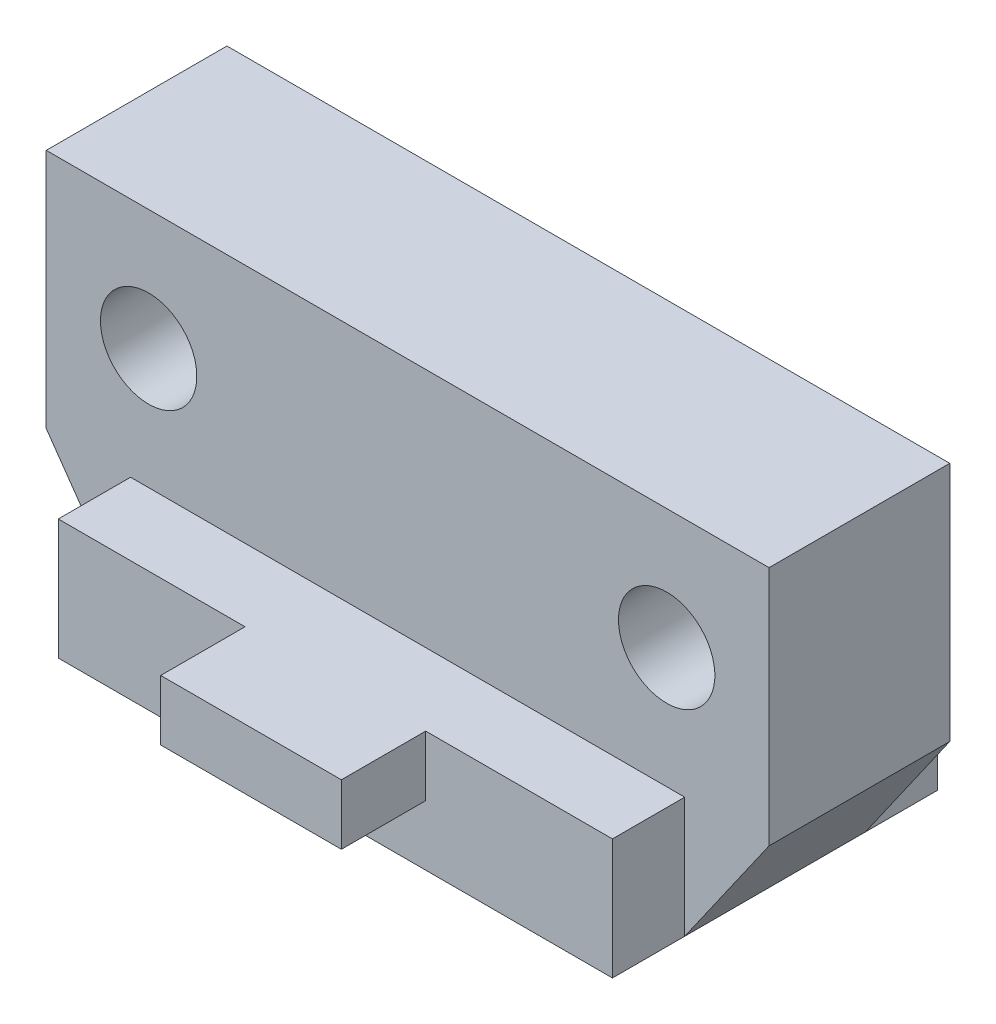
ISO-10303-21;
HEADER;
FILE_DESCRIPTION(('STEP AP214'),'2;1');
FILE_NAME('part.step','',(''),(''),'','','');
FILE_SCHEMA(('AUTOMOTIVE_DESIGN { 1 0 10303 214 1 1 1 1 }'));
ENDSEC;
DATA;
#1=APPLICATION_CONTEXT('core data for automotive mechanical design processes');
#2=APPLICATION_PROTOCOL_DEFINITION('international standard','automotive_design',2000,#1);
#3=PRODUCT_CONTEXT('',#1,'mechanical');
#4=PRODUCT('Part','Part','',(#3));
#5=PRODUCT_RELATED_PRODUCT_CATEGORY('part','',(#4));
#6=PRODUCT_DEFINITION_FORMATION('','',#4);
#7=PRODUCT_DEFINITION_CONTEXT('part definition',#1,'design');
#8=PRODUCT_DEFINITION('design','',#6,#7);
#9=PRODUCT_DEFINITION_SHAPE('','',#8);
#10=(LENGTH_UNIT() NAMED_UNIT(*) SI_UNIT(.MILLI.,.METRE.));
#11=(NAMED_UNIT(*) PLANE_ANGLE_UNIT() SI_UNIT($,.RADIAN.));
#12=(NAMED_UNIT(*) SI_UNIT($,.STERADIAN.) SOLID_ANGLE_UNIT());
#13=UNCERTAINTY_MEASURE_WITH_UNIT(LENGTH_MEASURE(1.E-05),#10,'distance_accuracy_value','');
#14=(GEOMETRIC_REPRESENTATION_CONTEXT(3) GLOBAL_UNCERTAINTY_ASSIGNED_CONTEXT((#13)) GLOBAL_UNIT_ASSIGNED_CONTEXT((#10,
#11,#12)) REPRESENTATION_CONTEXT('',''));
#15=CARTESIAN_POINT('',(0.,0.,0.));
#16=DIRECTION('',(0.,0.,1.));
#17=DIRECTION('',(1.,0.,0.));
#18=AXIS2_PLACEMENT_3D('',#15,#16,#17);
#19=CARTESIAN_POINT('',(46.,10.,0.));
#20=DIRECTION('',(-1.,0.,0.));
#21=DIRECTION('',(0.,0.,1.));
#22=AXIS2_PLACEMENT_3D('',#19,#20,#21);
#23=PLANE('',#22);
#24=DIRECTION('',(0.,1.,0.));
#25=VECTOR('',#24,1.);
#26=CARTESIAN_POINT('',(46.,10.,-21.));
#27=LINE('',#26,#25);
#28=CARTESIAN_POINT('',(46.,0.,-21.));
#29=VERTEX_POINT('',#28);
#30=CARTESIAN_POINT('',(46.,10.,-21.));
#31=VERTEX_POINT('',#30);
#32=EDGE_CURVE('E159',#29,#31,#27,.T.);
#33=ORIENTED_EDGE('',*,*,#32,.F.);
#34=DIRECTION('',(0.,0.,-1.));
#35=VECTOR('',#34,1.);
#36=CARTESIAN_POINT('',(46.,0.,0.));
#37=LINE('',#36,#35);
#38=CARTESIAN_POINT('',(46.,0.,-27.));
#39=VERTEX_POINT('',#38);
#40=EDGE_CURVE('E212',#29,#39,#37,.T.);
#41=ORIENTED_EDGE('',*,*,#40,.T.);
#42=DIRECTION('',(0.,-1.,0.));
#43=VECTOR('',#42,1.);
#44=CARTESIAN_POINT('',(46.,10.,-27.));
#45=LINE('',#44,#43);
#46=CARTESIAN_POINT('',(46.,10.,-27.));
#47=VERTEX_POINT('',#46);
#48=EDGE_CURVE('E218',#47,#39,#45,.T.);
#49=ORIENTED_EDGE('',*,*,#48,.F.);
#50=DIRECTION('',(0.,0.,-1.));
#51=VECTOR('',#50,1.);
#52=CARTESIAN_POINT('',(46.,10.,0.));
#53=LINE('',#52,#51);
#54=EDGE_CURVE('E167',#31,#47,#53,.T.);
#55=ORIENTED_EDGE('',*,*,#54,.F.);
#56=EDGE_LOOP('',(#33,#41,#49,#55));
#57=FACE_BOUND('',#56,.T.);
#58=ADVANCED_FACE('F33',(#57),#23,.F.);
#59=DIRECTION('',(0.,-1.,0.));
#60=VECTOR('',#59,1.);
#61=CARTESIAN_POINT('',(46.,10.,-6.));
#62=LINE('',#61,#60);
#63=CARTESIAN_POINT('',(46.,10.,-6.));
#64=VERTEX_POINT('',#63);
#65=CARTESIAN_POINT('',(46.,0.,-6.));
#66=VERTEX_POINT('',#65);
#67=EDGE_CURVE('E148',#64,#66,#62,.T.);
#68=ORIENTED_EDGE('',*,*,#67,.F.);
#69=CARTESIAN_POINT('',(46.,10.,0.));
#70=VERTEX_POINT('',#69);
#71=EDGE_CURVE('E152',#70,#64,#53,.T.);
#72=ORIENTED_EDGE('',*,*,#71,.F.);
#73=DIRECTION('',(0.,-1.,0.));
#74=VECTOR('',#73,1.);
#75=CARTESIAN_POINT('',(46.,10.,0.));
#76=LINE('',#75,#74);
#77=CARTESIAN_POINT('',(46.,0.,0.));
#78=VERTEX_POINT('',#77);
#79=EDGE_CURVE('E176',#70,#78,#76,.T.);
#80=ORIENTED_EDGE('',*,*,#79,.T.);
#81=EDGE_CURVE('E154',#78,#66,#37,.T.);
#82=ORIENTED_EDGE('',*,*,#81,.T.);
#83=EDGE_LOOP('',(#68,#72,#80,#82));
#84=FACE_BOUND('',#83,.T.);
#85=ADVANCED_FACE('F150',(#84),#23,.F.);
#86=CARTESIAN_POINT('',(0.,10.,0.));
#87=DIRECTION('',(1.,0.,0.));
#88=DIRECTION('',(0.,0.,-1.));
#89=AXIS2_PLACEMENT_3D('',#86,#87,#88);
#90=PLANE('',#89);
#91=DIRECTION('',(0.,1.,0.));
#92=VECTOR('',#91,1.);
#93=CARTESIAN_POINT('',(0.,10.,-6.));
#94=LINE('',#93,#92);
#95=CARTESIAN_POINT('',(0.,0.,-5.99999999999999));
#96=VERTEX_POINT('',#95);
#97=CARTESIAN_POINT('',(0.,10.,-6.));
#98=VERTEX_POINT('',#97);
#99=EDGE_CURVE('E173',#96,#98,#94,.T.);
#100=ORIENTED_EDGE('',*,*,#99,.F.);
#101=DIRECTION('',(0.,0.,1.));
#102=VECTOR('',#101,1.);
#103=CARTESIAN_POINT('',(0.,0.,0.));
#104=LINE('',#103,#102);
#105=CARTESIAN_POINT('',(0.,0.,0.));
#106=VERTEX_POINT('',#105);
#107=EDGE_CURVE('E197',#96,#106,#104,.T.);
#108=ORIENTED_EDGE('',*,*,#107,.T.);
#109=DIRECTION('',(0.,-1.,0.));
#110=VECTOR('',#109,1.);
#111=CARTESIAN_POINT('',(0.,10.,0.));
#112=LINE('',#111,#110);
#113=CARTESIAN_POINT('',(0.,10.,0.));
#114=VERTEX_POINT('',#113);
#115=EDGE_CURVE('E37',#114,#106,#112,.T.);
#116=ORIENTED_EDGE('',*,*,#115,.F.);
#117=DIRECTION('',(0.,0.,1.));
#118=VECTOR('',#117,1.);
#119=CARTESIAN_POINT('',(0.,10.,0.));
#120=LINE('',#119,#118);
#121=EDGE_CURVE('E201',#98,#114,#120,.T.);
#122=ORIENTED_EDGE('',*,*,#121,.F.);
#123=EDGE_LOOP('',(#100,#108,#116,#122));
#124=FACE_BOUND('',#123,.T.);
#125=ADVANCED_FACE('F35',(#124),#90,.F.);
#126=DIRECTION('',(0.,-1.,0.));
#127=VECTOR('',#126,1.);
#128=CARTESIAN_POINT('',(0.,10.,-21.));
#129=LINE('',#128,#127);
#130=CARTESIAN_POINT('',(0.,10.,-21.));
#131=VERTEX_POINT('',#130);
#132=CARTESIAN_POINT('',(0.,0.,-21.));
#133=VERTEX_POINT('',#132);
#134=EDGE_CURVE('E230',#131,#133,#129,.T.);
#135=ORIENTED_EDGE('',*,*,#134,.F.);
#136=CARTESIAN_POINT('',(0.,10.,-27.));
#137=VERTEX_POINT('',#136);
#138=EDGE_CURVE('E198',#137,#131,#120,.T.);
#139=ORIENTED_EDGE('',*,*,#138,.F.);
#140=DIRECTION('',(0.,-1.,0.));
#141=VECTOR('',#140,1.);
#142=CARTESIAN_POINT('',(0.,10.,-27.));
#143=LINE('',#142,#141);
#144=CARTESIAN_POINT('',(0.,0.,-27.));
#145=VERTEX_POINT('',#144);
#146=EDGE_CURVE('E206',#137,#145,#143,.T.);
#147=ORIENTED_EDGE('',*,*,#146,.T.);
#148=EDGE_CURVE('E207',#145,#133,#104,.T.);
#149=ORIENTED_EDGE('',*,*,#148,.T.);
#150=EDGE_LOOP('',(#135,#139,#147,#149));
#151=FACE_BOUND('',#150,.T.);
#152=ADVANCED_FACE('F319',(#151),#90,.F.);
#153=CARTESIAN_POINT('',(0.,10.,0.));
#154=DIRECTION('',(0.,0.,-1.));
#155=DIRECTION('',(-1.,0.,0.));
#156=AXIS2_PLACEMENT_3D('',#153,#154,#155);
#157=PLANE('',#156);
#158=DIRECTION('',(0.,-1.,0.));
#159=VECTOR('',#158,1.);
#160=CARTESIAN_POINT('',(15.5,10.,0.));
#161=LINE('',#160,#159);
#162=CARTESIAN_POINT('',(15.5,10.,0.));
#163=VERTEX_POINT('',#162);
#164=CARTESIAN_POINT('',(15.5,5.,0.));
#165=VERTEX_POINT('',#164);
#166=EDGE_CURVE('E245',#163,#165,#161,.T.);
#167=ORIENTED_EDGE('',*,*,#166,.F.);
#168=DIRECTION('',(1.,0.,0.));
#169=VECTOR('',#168,1.);
#170=CARTESIAN_POINT('',(0.,10.,0.));
#171=LINE('',#170,#169);
#172=EDGE_CURVE('E202',#114,#163,#171,.T.);
#173=ORIENTED_EDGE('',*,*,#172,.F.);
#174=ORIENTED_EDGE('',*,*,#115,.T.);
#175=DIRECTION('',(1.,0.,0.));
#176=VECTOR('',#175,1.);
#177=CARTESIAN_POINT('',(0.,0.,0.));
#178=LINE('',#177,#176);
#179=EDGE_CURVE('E210',#106,#78,#178,.T.);
#180=ORIENTED_EDGE('',*,*,#179,.T.);
#181=ORIENTED_EDGE('',*,*,#79,.F.);
#182=CARTESIAN_POINT('',(30.5,10.,0.));
#183=VERTEX_POINT('',#182);
#184=EDGE_CURVE('E56',#183,#70,#171,.T.);
#185=ORIENTED_EDGE('',*,*,#184,.F.);
#186=DIRECTION('',(0.,1.,0.));
#187=VECTOR('',#186,1.);
#188=CARTESIAN_POINT('',(30.5,10.,0.));
#189=LINE('',#188,#187);
#190=CARTESIAN_POINT('',(30.5,5.00000000000001,0.));
#191=VERTEX_POINT('',#190);
#192=EDGE_CURVE('E251',#191,#183,#189,.T.);
#193=ORIENTED_EDGE('',*,*,#192,.F.);
#194=DIRECTION('',(1.,0.,0.));
#195=VECTOR('',#194,1.);
#196=CARTESIAN_POINT('',(15.5,5.,0.));
#197=LINE('',#196,#195);
#198=EDGE_CURVE('E50',#165,#191,#197,.T.);
#199=ORIENTED_EDGE('',*,*,#198,.F.);
#200=EDGE_LOOP('',(#167,#173,#174,#180,#181,#185,#193,#199));
#201=FACE_BOUND('',#200,.T.);
#202=ADVANCED_FACE('F335',(#201),#157,.F.);
#203=CARTESIAN_POINT('',(0.,10.,0.));
#204=DIRECTION('',(0.,-1.,0.));
#205=DIRECTION('',(0.,0.,-1.));
#206=AXIS2_PLACEMENT_3D('',#203,#204,#205);
#207=PLANE('',#206);
#208=DIRECTION('',(-1.,0.,0.));
#209=VECTOR('',#208,1.);
#210=CARTESIAN_POINT('',(-7.,10.,-21.));
#211=LINE('',#210,#209);
#212=EDGE_CURVE('E11',#31,#131,#211,.T.);
#213=ORIENTED_EDGE('',*,*,#212,.F.);
#214=ORIENTED_EDGE('',*,*,#54,.T.);
#215=DIRECTION('',(-1.,0.,0.));
#216=VECTOR('',#215,1.);
#217=CARTESIAN_POINT('',(0.,10.,-27.));
#218=LINE('',#217,#216);
#219=EDGE_CURVE('E166',#47,#137,#218,.T.);
#220=ORIENTED_EDGE('',*,*,#219,.T.);
#221=ORIENTED_EDGE('',*,*,#138,.T.);
#222=EDGE_LOOP('',(#213,#214,#220,#221));
#223=FACE_BOUND('',#222,.T.);
#224=ADVANCED_FACE('F313',(#223),#207,.F.);
#225=DIRECTION('',(1.,0.,0.));
#226=VECTOR('',#225,1.);
#227=CARTESIAN_POINT('',(-6.99999999999999,10.,-6.));
#228=LINE('',#227,#226);
#229=EDGE_CURVE('E42',#98,#64,#228,.T.);
#230=ORIENTED_EDGE('',*,*,#229,.F.);
#231=ORIENTED_EDGE('',*,*,#121,.T.);
#232=ORIENTED_EDGE('',*,*,#172,.T.);
#233=DIRECTION('',(0.,0.,-1.));
#234=VECTOR('',#233,1.);
#235=CARTESIAN_POINT('',(15.5,10.,7.));
#236=LINE('',#235,#234);
#237=CARTESIAN_POINT('',(15.5,10.,7.));
#238=VERTEX_POINT('',#237);
#239=EDGE_CURVE('E257',#238,#163,#236,.T.);
#240=ORIENTED_EDGE('',*,*,#239,.F.);
#241=DIRECTION('',(-1.,0.,0.));
#242=VECTOR('',#241,1.);
#243=CARTESIAN_POINT('',(15.5,10.,7.));
#244=LINE('',#243,#242);
#245=CARTESIAN_POINT('',(30.5,10.,7.));
#246=VERTEX_POINT('',#245);
#247=EDGE_CURVE('E255',#246,#238,#244,.T.);
#248=ORIENTED_EDGE('',*,*,#247,.F.);
#249=DIRECTION('',(0.,0.,-1.));
#250=VECTOR('',#249,1.);
#251=CARTESIAN_POINT('',(30.5,10.,7.));
#252=LINE('',#251,#250);
#253=EDGE_CURVE('E264',#246,#183,#252,.T.);
#254=ORIENTED_EDGE('',*,*,#253,.T.);
#255=ORIENTED_EDGE('',*,*,#184,.T.);
#256=ORIENTED_EDGE('',*,*,#71,.T.);
#257=EDGE_LOOP('',(#230,#231,#232,#240,#248,#254,#255,#256));
#258=FACE_BOUND('',#257,.T.);
#259=ADVANCED_FACE('F163',(#258),#207,.F.);
#260=CARTESIAN_POINT('',(0.,10.,-27.));
#261=DIRECTION('',(0.,0.,1.));
#262=DIRECTION('',(1.,0.,0.));
#263=AXIS2_PLACEMENT_3D('',#260,#261,#262);
#264=PLANE('',#263);
#265=DIRECTION('',(-1.,0.,0.));
#266=VECTOR('',#265,1.);
#267=CARTESIAN_POINT('',(0.,0.,-27.));
#268=LINE('',#267,#266);
#269=EDGE_CURVE('E214',#39,#145,#268,.T.);
#270=ORIENTED_EDGE('',*,*,#269,.T.);
#271=ORIENTED_EDGE('',*,*,#146,.F.);
#272=ORIENTED_EDGE('',*,*,#219,.F.);
#273=ORIENTED_EDGE('',*,*,#48,.T.);
#274=EDGE_LOOP('',(#270,#271,#272,#273));
#275=FACE_BOUND('',#274,.T.);
#276=ADVANCED_FACE('F321',(#275),#264,.F.);
#277=CARTESIAN_POINT('',(0.,0.,0.));
#278=DIRECTION('',(0.,-1.,0.));
#279=DIRECTION('',(0.,0.,-1.));
#280=AXIS2_PLACEMENT_3D('',#277,#278,#279);
#281=PLANE('',#280);
#282=ORIENTED_EDGE('',*,*,#148,.F.);
#283=ORIENTED_EDGE('',*,*,#269,.F.);
#284=ORIENTED_EDGE('',*,*,#40,.F.);
#285=DIRECTION('',(0.,0.,-1.));
#286=VECTOR('',#285,1.);
#287=CARTESIAN_POINT('',(46.,0.,-6.));
#288=LINE('',#287,#286);
#289=EDGE_CURVE('E226',#66,#29,#288,.T.);
#290=ORIENTED_EDGE('',*,*,#289,.F.);
#291=ORIENTED_EDGE('',*,*,#81,.F.);
#292=ORIENTED_EDGE('',*,*,#179,.F.);
#293=ORIENTED_EDGE('',*,*,#107,.F.);
#294=DIRECTION('',(0.,0.,1.));
#295=VECTOR('',#294,1.);
#296=CARTESIAN_POINT('',(0.,0.,-21.));
#297=LINE('',#296,#295);
#298=EDGE_CURVE('E242',#133,#96,#297,.T.);
#299=ORIENTED_EDGE('',*,*,#298,.F.);
#300=EDGE_LOOP('',(#282,#283,#284,#290,#291,#292,#293,#299));
#301=FACE_BOUND('',#300,.T.);
#302=ADVANCED_FACE('F223',(#301),#281,.T.);
#303=CARTESIAN_POINT('',(-7.,30.,-21.));
#304=DIRECTION('',(1.,0.,0.));
#305=DIRECTION('',(0.,0.,-1.));
#306=AXIS2_PLACEMENT_3D('',#303,#304,#305);
#307=PLANE('',#306);
#308=DIRECTION('',(0.,0.,1.));
#309=VECTOR('',#308,1.);
#310=CARTESIAN_POINT('',(-7.,10.,-21.));
#311=LINE('',#310,#309);
#312=CARTESIAN_POINT('',(-7.,10.,-21.));
#313=VERTEX_POINT('',#312);
#314=CARTESIAN_POINT('',(-7.,10.,-6.));
#315=VERTEX_POINT('',#314);
#316=EDGE_CURVE('E179',#313,#315,#311,.T.);
#317=ORIENTED_EDGE('',*,*,#316,.T.);
#318=DIRECTION('',(0.,-1.,0.));
#319=VECTOR('',#318,1.);
#320=CARTESIAN_POINT('',(-6.99999999999999,30.,-6.));
#321=LINE('',#320,#319);
#322=CARTESIAN_POINT('',(-6.99999999999999,30.,-6.));
#323=VERTEX_POINT('',#322);
#324=EDGE_CURVE('E195',#323,#315,#321,.T.);
#325=ORIENTED_EDGE('',*,*,#324,.F.);
#326=DIRECTION('',(0.,0.,1.));
#327=VECTOR('',#326,1.);
#328=CARTESIAN_POINT('',(-7.,30.,-21.));
#329=LINE('',#328,#327);
#330=CARTESIAN_POINT('',(-7.,30.,-21.));
#331=VERTEX_POINT('',#330);
#332=EDGE_CURVE('E183',#331,#323,#329,.T.);
#333=ORIENTED_EDGE('',*,*,#332,.F.);
#334=DIRECTION('',(0.,-1.,0.));
#335=VECTOR('',#334,1.);
#336=CARTESIAN_POINT('',(-7.,30.,-21.));
#337=LINE('',#336,#335);
#338=EDGE_CURVE('E185',#331,#313,#337,.T.);
#339=ORIENTED_EDGE('',*,*,#338,.T.);
#340=EDGE_LOOP('',(#317,#325,#333,#339));
#341=FACE_BOUND('',#340,.T.);
#342=ADVANCED_FACE('F301',(#341),#307,.F.);
#343=CARTESIAN_POINT('',(-6.99999999999999,30.,-6.));
#344=DIRECTION('',(0.,0.,-1.));
#345=DIRECTION('',(-1.,0.,0.));
#346=AXIS2_PLACEMENT_3D('',#343,#344,#345);
#347=PLANE('',#346);
#348=CARTESIAN_POINT('',(44.5,20.,-6.));
#349=DIRECTION('',(0.,0.,-1.));
#350=DIRECTION('',(-1.,0.,0.));
#351=AXIS2_PLACEMENT_3D('',#348,#349,#350);
#352=CIRCLE('',#351,4.);
#353=CARTESIAN_POINT('',(40.5,20.,-6.));
#354=VERTEX_POINT('',#353);
#355=EDGE_CURVE('E280',#354,#354,#352,.T.);
#356=ORIENTED_EDGE('',*,*,#355,.T.);
#357=EDGE_LOOP('',(#356));
#358=FACE_BOUND('',#357,.T.);
#359=CARTESIAN_POINT('',(1.5,20.,-6.));
#360=DIRECTION('',(0.,0.,-1.));
#361=DIRECTION('',(-1.,0.,0.));
#362=AXIS2_PLACEMENT_3D('',#359,#360,#361);
#363=CIRCLE('',#362,4.);
#364=CARTESIAN_POINT('',(-2.5,20.,-6.));
#365=VERTEX_POINT('',#364);
#366=EDGE_CURVE('E275',#365,#365,#363,.T.);
#367=ORIENTED_EDGE('',*,*,#366,.T.);
#368=EDGE_LOOP('',(#367));
#369=FACE_BOUND('',#368,.T.);
#370=ORIENTED_EDGE('',*,*,#324,.T.);
#371=DIRECTION('',(0.573462344363329,-0.81923192051904,0.));
#372=VECTOR('',#371,1.);
#373=CARTESIAN_POINT('',(-12.4316726028097,17.7595322897281,-6.));
#374=LINE('',#373,#372);
#375=EDGE_CURVE('E239',#315,#96,#374,.T.);
#376=ORIENTED_EDGE('',*,*,#375,.T.);
#377=ORIENTED_EDGE('',*,*,#99,.T.);
#378=ORIENTED_EDGE('',*,*,#229,.T.);
#379=ORIENTED_EDGE('',*,*,#67,.T.);
#380=DIRECTION('',(0.573462344363328,0.81923192051904,0.));
#381=VECTOR('',#380,1.);
#382=CARTESIAN_POINT('',(58.4316726028097,17.7595322897281,-6.));
#383=LINE('',#382,#381);
#384=CARTESIAN_POINT('',(53.,10.,-6.));
#385=VERTEX_POINT('',#384);
#386=EDGE_CURVE('E231',#66,#385,#383,.T.);
#387=ORIENTED_EDGE('',*,*,#386,.T.);
#388=DIRECTION('',(0.,-1.,0.));
#389=VECTOR('',#388,1.);
#390=CARTESIAN_POINT('',(53.,30.,-6.));
#391=LINE('',#390,#389);
#392=CARTESIAN_POINT('',(53.,30.,-6.));
#393=VERTEX_POINT('',#392);
#394=EDGE_CURVE('E192',#393,#385,#391,.T.);
#395=ORIENTED_EDGE('',*,*,#394,.F.);
#396=DIRECTION('',(1.,0.,0.));
#397=VECTOR('',#396,1.);
#398=CARTESIAN_POINT('',(-6.99999999999999,30.,-6.));
#399=LINE('',#398,#397);
#400=EDGE_CURVE('E285',#323,#393,#399,.T.);
#401=ORIENTED_EDGE('',*,*,#400,.F.);
#402=EDGE_LOOP('',(#370,#376,#377,#378,#379,#387,#395,#401));
#403=FACE_BOUND('',#402,.T.);
#404=ADVANCED_FACE('F170',(#358,#369,#403),#347,.F.);
#405=CARTESIAN_POINT('',(53.,30.,-21.));
#406=DIRECTION('',(-1.,0.,0.));
#407=DIRECTION('',(0.,0.,1.));
#408=AXIS2_PLACEMENT_3D('',#405,#406,#407);
#409=PLANE('',#408);
#410=DIRECTION('',(0.,0.,-1.));
#411=VECTOR('',#410,1.);
#412=CARTESIAN_POINT('',(53.,10.,-21.));
#413=LINE('',#412,#411);
#414=CARTESIAN_POINT('',(53.,10.,-21.));
#415=VERTEX_POINT('',#414);
#416=EDGE_CURVE('E181',#385,#415,#413,.T.);
#417=ORIENTED_EDGE('',*,*,#416,.T.);
#418=DIRECTION('',(0.,-1.,0.));
#419=VECTOR('',#418,1.);
#420=CARTESIAN_POINT('',(53.,30.,-21.));
#421=LINE('',#420,#419);
#422=CARTESIAN_POINT('',(53.,30.,-21.));
#423=VERTEX_POINT('',#422);
#424=EDGE_CURVE('E188',#423,#415,#421,.T.);
#425=ORIENTED_EDGE('',*,*,#424,.F.);
#426=DIRECTION('',(0.,0.,-1.));
#427=VECTOR('',#426,1.);
#428=CARTESIAN_POINT('',(53.,30.,-21.));
#429=LINE('',#428,#427);
#430=EDGE_CURVE('E287',#393,#423,#429,.T.);
#431=ORIENTED_EDGE('',*,*,#430,.F.);
#432=ORIENTED_EDGE('',*,*,#394,.T.);
#433=EDGE_LOOP('',(#417,#425,#431,#432));
#434=FACE_BOUND('',#433,.T.);
#435=ADVANCED_FACE('F304',(#434),#409,.F.);
#436=CARTESIAN_POINT('',(-7.,30.,-21.));
#437=DIRECTION('',(0.,0.,1.));
#438=DIRECTION('',(1.,0.,0.));
#439=AXIS2_PLACEMENT_3D('',#436,#437,#438);
#440=PLANE('',#439);
#441=CARTESIAN_POINT('',(44.5,20.,-21.));
#442=DIRECTION('',(0.,0.,-1.));
#443=DIRECTION('',(-1.,0.,0.));
#444=AXIS2_PLACEMENT_3D('',#441,#442,#443);
#445=CIRCLE('',#444,4.);
#446=CARTESIAN_POINT('',(40.5,20.,-21.));
#447=VERTEX_POINT('',#446);
#448=EDGE_CURVE('E272',#447,#447,#445,.T.);
#449=ORIENTED_EDGE('',*,*,#448,.F.);
#450=EDGE_LOOP('',(#449));
#451=FACE_BOUND('',#450,.T.);
#452=CARTESIAN_POINT('',(1.5,20.,-21.));
#453=DIRECTION('',(0.,0.,-1.));
#454=DIRECTION('',(1.,0.,0.));
#455=AXIS2_PLACEMENT_3D('',#452,#453,#454);
#456=CIRCLE('',#455,4.);
#457=CARTESIAN_POINT('',(5.5,20.,-21.));
#458=VERTEX_POINT('',#457);
#459=EDGE_CURVE('E271',#458,#458,#456,.T.);
#460=ORIENTED_EDGE('',*,*,#459,.F.);
#461=EDGE_LOOP('',(#460));
#462=FACE_BOUND('',#461,.T.);
#463=ORIENTED_EDGE('',*,*,#424,.T.);
#464=DIRECTION('',(-0.573462344363328,-0.81923192051904,0.));
#465=VECTOR('',#464,1.);
#466=CARTESIAN_POINT('',(58.4316726028097,17.7595322897281,-21.));
#467=LINE('',#466,#465);
#468=EDGE_CURVE('E235',#415,#29,#467,.T.);
#469=ORIENTED_EDGE('',*,*,#468,.T.);
#470=ORIENTED_EDGE('',*,*,#32,.T.);
#471=ORIENTED_EDGE('',*,*,#212,.T.);
#472=ORIENTED_EDGE('',*,*,#134,.T.);
#473=DIRECTION('',(-0.573462344363329,0.81923192051904,0.));
#474=VECTOR('',#473,1.);
#475=CARTESIAN_POINT('',(-12.4316726028097,17.7595322897281,-21.));
#476=LINE('',#475,#474);
#477=EDGE_CURVE('E241',#133,#313,#476,.T.);
#478=ORIENTED_EDGE('',*,*,#477,.T.);
#479=ORIENTED_EDGE('',*,*,#338,.F.);
#480=DIRECTION('',(-1.,0.,0.));
#481=VECTOR('',#480,1.);
#482=CARTESIAN_POINT('',(-7.,30.,-21.));
#483=LINE('',#482,#481);
#484=EDGE_CURVE('E189',#423,#331,#483,.T.);
#485=ORIENTED_EDGE('',*,*,#484,.F.);
#486=EDGE_LOOP('',(#463,#469,#470,#471,#472,#478,#479,#485));
#487=FACE_BOUND('',#486,.T.);
#488=ADVANCED_FACE('F297',(#451,#462,#487),#440,.F.);
#489=CARTESIAN_POINT('',(0.,30.,0.));
#490=DIRECTION('',(0.,1.,0.));
#491=DIRECTION('',(0.,0.,1.));
#492=AXIS2_PLACEMENT_3D('',#489,#490,#491);
#493=PLANE('',#492);
#494=ORIENTED_EDGE('',*,*,#332,.T.);
#495=ORIENTED_EDGE('',*,*,#400,.T.);
#496=ORIENTED_EDGE('',*,*,#430,.T.);
#497=ORIENTED_EDGE('',*,*,#484,.T.);
#498=EDGE_LOOP('',(#494,#495,#496,#497));
#499=FACE_BOUND('',#498,.T.);
#500=ADVANCED_FACE('F291',(#499),#493,.T.);
#501=CARTESIAN_POINT('',(1.5,20.,0.));
#502=DIRECTION('',(0.,0.,-1.));
#503=DIRECTION('',(-1.,0.,0.));
#504=AXIS2_PLACEMENT_3D('',#501,#502,#503);
#505=CYLINDRICAL_SURFACE('',#504,4.);
#506=ORIENTED_EDGE('',*,*,#459,.T.);
#507=EDGE_LOOP('',(#506));
#508=FACE_BOUND('',#507,.T.);
#509=ORIENTED_EDGE('',*,*,#366,.F.);
#510=EDGE_LOOP('',(#509));
#511=FACE_BOUND('',#510,.T.);
#512=ADVANCED_FACE('F371',(#508,#511),#505,.F.);
#513=CARTESIAN_POINT('',(44.5,20.,0.));
#514=DIRECTION('',(0.,0.,-1.));
#515=DIRECTION('',(-1.,0.,0.));
#516=AXIS2_PLACEMENT_3D('',#513,#514,#515);
#517=CYLINDRICAL_SURFACE('',#516,4.);
#518=ORIENTED_EDGE('',*,*,#448,.T.);
#519=EDGE_LOOP('',(#518));
#520=FACE_BOUND('',#519,.T.);
#521=ORIENTED_EDGE('',*,*,#355,.F.);
#522=EDGE_LOOP('',(#521));
#523=FACE_BOUND('',#522,.T.);
#524=ADVANCED_FACE('F365',(#520,#523),#517,.F.);
#525=CARTESIAN_POINT('',(15.5,10.,7.));
#526=DIRECTION('',(1.,0.,0.));
#527=DIRECTION('',(0.,1.,0.));
#528=AXIS2_PLACEMENT_3D('',#525,#526,#527);
#529=PLANE('',#528);
#530=ORIENTED_EDGE('',*,*,#166,.T.);
#531=DIRECTION('',(0.,0.,-1.));
#532=VECTOR('',#531,1.);
#533=CARTESIAN_POINT('',(15.5,5.,7.));
#534=LINE('',#533,#532);
#535=CARTESIAN_POINT('',(15.5,5.,7.));
#536=VERTEX_POINT('',#535);
#537=EDGE_CURVE('E269',#536,#165,#534,.T.);
#538=ORIENTED_EDGE('',*,*,#537,.F.);
#539=DIRECTION('',(0.,-1.,0.));
#540=VECTOR('',#539,1.);
#541=CARTESIAN_POINT('',(15.5,10.,7.));
#542=LINE('',#541,#540);
#543=EDGE_CURVE('E247',#238,#536,#542,.T.);
#544=ORIENTED_EDGE('',*,*,#543,.F.);
#545=ORIENTED_EDGE('',*,*,#239,.T.);
#546=EDGE_LOOP('',(#530,#538,#544,#545));
#547=FACE_BOUND('',#546,.T.);
#548=ADVANCED_FACE('F348',(#547),#529,.F.);
#549=CARTESIAN_POINT('',(15.5,5.,7.));
#550=DIRECTION('',(0.,1.,0.));
#551=DIRECTION('',(-1.,0.,0.));
#552=AXIS2_PLACEMENT_3D('',#549,#550,#551);
#553=PLANE('',#552);
#554=ORIENTED_EDGE('',*,*,#198,.T.);
#555=DIRECTION('',(0.,0.,-1.));
#556=VECTOR('',#555,1.);
#557=CARTESIAN_POINT('',(30.5,5.00000000000001,7.));
#558=LINE('',#557,#556);
#559=CARTESIAN_POINT('',(30.5,5.00000000000001,7.));
#560=VERTEX_POINT('',#559);
#561=EDGE_CURVE('E266',#560,#191,#558,.T.);
#562=ORIENTED_EDGE('',*,*,#561,.F.);
#563=DIRECTION('',(1.,0.,0.));
#564=VECTOR('',#563,1.);
#565=CARTESIAN_POINT('',(15.5,5.,7.));
#566=LINE('',#565,#564);
#567=EDGE_CURVE('E250',#536,#560,#566,.T.);
#568=ORIENTED_EDGE('',*,*,#567,.F.);
#569=ORIENTED_EDGE('',*,*,#537,.T.);
#570=EDGE_LOOP('',(#554,#562,#568,#569));
#571=FACE_BOUND('',#570,.T.);
#572=ADVANCED_FACE('F357',(#571),#553,.F.);
#573=CARTESIAN_POINT('',(30.5,10.,7.));
#574=DIRECTION('',(-1.,0.,0.));
#575=DIRECTION('',(0.,0.,1.));
#576=AXIS2_PLACEMENT_3D('',#573,#574,#575);
#577=PLANE('',#576);
#578=ORIENTED_EDGE('',*,*,#192,.T.);
#579=ORIENTED_EDGE('',*,*,#253,.F.);
#580=DIRECTION('',(0.,1.,0.));
#581=VECTOR('',#580,1.);
#582=CARTESIAN_POINT('',(30.5,10.,7.));
#583=LINE('',#582,#581);
#584=EDGE_CURVE('E253',#560,#246,#583,.T.);
#585=ORIENTED_EDGE('',*,*,#584,.F.);
#586=ORIENTED_EDGE('',*,*,#561,.T.);
#587=EDGE_LOOP('',(#578,#579,#585,#586));
#588=FACE_BOUND('',#587,.T.);
#589=ADVANCED_FACE('F355',(#588),#577,.F.);
#590=CARTESIAN_POINT('',(0.,0.,7.));
#591=DIRECTION('',(0.,0.,1.));
#592=DIRECTION('',(1.,0.,0.));
#593=AXIS2_PLACEMENT_3D('',#590,#591,#592);
#594=PLANE('',#593);
#595=ORIENTED_EDGE('',*,*,#543,.T.);
#596=ORIENTED_EDGE('',*,*,#567,.T.);
#597=ORIENTED_EDGE('',*,*,#584,.T.);
#598=ORIENTED_EDGE('',*,*,#247,.T.);
#599=EDGE_LOOP('',(#595,#596,#597,#598));
#600=FACE_BOUND('',#599,.T.);
#601=ADVANCED_FACE('F350',(#600),#594,.T.);
#602=CARTESIAN_POINT('',(0.,0.,0.));
#603=DIRECTION('',(0.81923192051904,0.573462344363329,0.));
#604=DIRECTION('',(-0.573462344363329,0.81923192051904,0.));
#605=AXIS2_PLACEMENT_3D('',#602,#603,#604);
#606=PLANE('',#605);
#607=ORIENTED_EDGE('',*,*,#298,.T.);
#608=ORIENTED_EDGE('',*,*,#375,.F.);
#609=ORIENTED_EDGE('',*,*,#316,.F.);
#610=ORIENTED_EDGE('',*,*,#477,.F.);
#611=EDGE_LOOP('',(#607,#608,#609,#610));
#612=FACE_BOUND('',#611,.T.);
#613=ADVANCED_FACE('F500',(#612),#606,.F.);
#614=CARTESIAN_POINT('',(30.8724832214765,-21.6107382550336,0.));
#615=DIRECTION('',(-0.81923192051904,0.573462344363328,0.));
#616=DIRECTION('',(-0.573462344363328,-0.81923192051904,0.));
#617=AXIS2_PLACEMENT_3D('',#614,#615,#616);
#618=PLANE('',#617);
#619=ORIENTED_EDGE('',*,*,#289,.T.);
#620=ORIENTED_EDGE('',*,*,#468,.F.);
#621=ORIENTED_EDGE('',*,*,#416,.F.);
#622=ORIENTED_EDGE('',*,*,#386,.F.);
#623=EDGE_LOOP('',(#619,#620,#621,#622));
#624=FACE_BOUND('',#623,.T.);
#625=ADVANCED_FACE('F505',(#624),#618,.F.);
#626=CLOSED_SHELL('',(#58,#85,#125,#152,#202,#224,#259,#276,#302,#342,#404,#435,#488,#500,#512,
#524,#548,#572,#589,#601,#613,#625));
#627=MANIFOLD_SOLID_BREP('B2',#626);
#628=ADVANCED_BREP_SHAPE_REPRESENTATION('',(#18,#627),#14);
#629=SHAPE_DEFINITION_REPRESENTATION(#9,#628);
ENDSEC;
END-ISO-10303-21;
